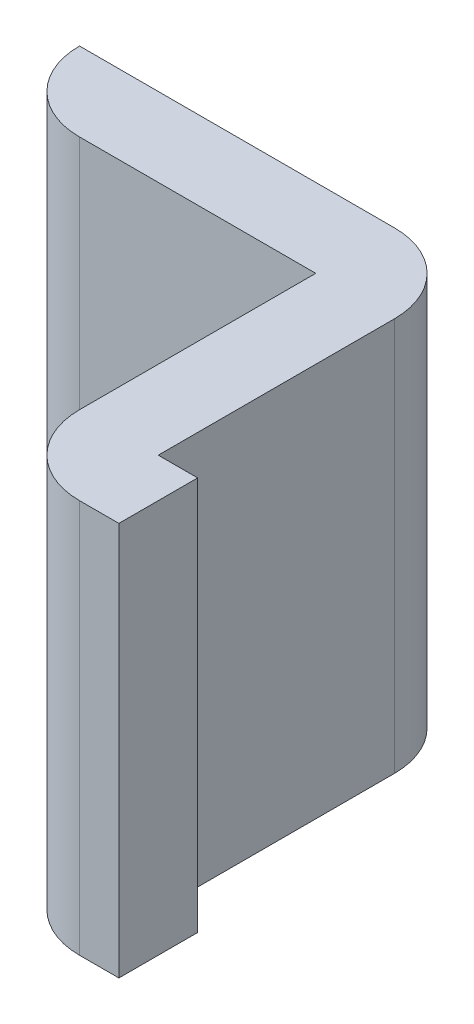
ISO-10303-21;
HEADER;
FILE_DESCRIPTION(('STEP AP214'),'2;1');
FILE_NAME('part.step','',(''),(''),'','','');
FILE_SCHEMA(('AUTOMOTIVE_DESIGN { 1 0 10303 214 1 1 1 1 }'));
ENDSEC;
DATA;
#1=APPLICATION_CONTEXT('core data for automotive mechanical design processes');
#2=APPLICATION_PROTOCOL_DEFINITION('international standard','automotive_design',2000,#1);
#3=PRODUCT_CONTEXT('',#1,'mechanical');
#4=PRODUCT('Part','Part','',(#3));
#5=PRODUCT_RELATED_PRODUCT_CATEGORY('part','',(#4));
#6=PRODUCT_DEFINITION_FORMATION('','',#4);
#7=PRODUCT_DEFINITION_CONTEXT('part definition',#1,'design');
#8=PRODUCT_DEFINITION('design','',#6,#7);
#9=PRODUCT_DEFINITION_SHAPE('','',#8);
#10=(LENGTH_UNIT() NAMED_UNIT(*) SI_UNIT(.MILLI.,.METRE.));
#11=(NAMED_UNIT(*) PLANE_ANGLE_UNIT() SI_UNIT($,.RADIAN.));
#12=(NAMED_UNIT(*) SI_UNIT($,.STERADIAN.) SOLID_ANGLE_UNIT());
#13=UNCERTAINTY_MEASURE_WITH_UNIT(LENGTH_MEASURE(1.E-05),#10,'distance_accuracy_value','');
#14=(GEOMETRIC_REPRESENTATION_CONTEXT(3) GLOBAL_UNCERTAINTY_ASSIGNED_CONTEXT((#13)) GLOBAL_UNIT_ASSIGNED_CONTEXT((#10,
#11,#12)) REPRESENTATION_CONTEXT('',''));
#15=CARTESIAN_POINT('',(0.,0.,0.));
#16=DIRECTION('',(0.,0.,1.));
#17=DIRECTION('',(1.,0.,0.));
#18=AXIS2_PLACEMENT_3D('',#15,#16,#17);
#19=CARTESIAN_POINT('',(0.3429,-0.1905,0.3048));
#20=DIRECTION('',(-1.,0.,0.));
#21=DIRECTION('',(0.,0.,1.));
#22=AXIS2_PLACEMENT_3D('',#19,#20,#21);
#23=PLANE('',#22);
#24=DIRECTION('',(0.,-1.,0.));
#25=VECTOR('',#24,1.);
#26=CARTESIAN_POINT('',(0.3429,-0.1905,0.0762));
#27=LINE('',#26,#25);
#28=CARTESIAN_POINT('',(0.3429,0.1905,0.0762));
#29=VERTEX_POINT('',#28);
#30=CARTESIAN_POINT('',(0.3429,-0.1905,0.0762));
#31=VERTEX_POINT('',#30);
#32=EDGE_CURVE('E83',#29,#31,#27,.T.);
#33=ORIENTED_EDGE('',*,*,#32,.F.);
#34=DIRECTION('',(0.,0.,-1.));
#35=VECTOR('',#34,1.);
#36=CARTESIAN_POINT('',(0.3429,0.1905,0.));
#37=LINE('',#36,#35);
#38=CARTESIAN_POINT('',(0.3429,0.1905,0.3048));
#39=VERTEX_POINT('',#38);
#40=EDGE_CURVE('E80',#29,#39,#37,.F.);
#41=ORIENTED_EDGE('',*,*,#40,.T.);
#42=DIRECTION('',(0.,1.,0.));
#43=VECTOR('',#42,1.);
#44=CARTESIAN_POINT('',(0.3429,-0.1905,0.3048));
#45=LINE('',#44,#43);
#46=CARTESIAN_POINT('',(0.3429,-0.1905,0.3048));
#47=VERTEX_POINT('',#46);
#48=EDGE_CURVE('E148',#39,#47,#45,.F.);
#49=ORIENTED_EDGE('',*,*,#48,.T.);
#50=DIRECTION('',(0.,0.,-1.));
#51=VECTOR('',#50,1.);
#52=CARTESIAN_POINT('',(0.3429,-0.1905,0.));
#53=LINE('',#52,#51);
#54=EDGE_CURVE('E153',#31,#47,#53,.F.);
#55=ORIENTED_EDGE('',*,*,#54,.F.);
#56=EDGE_LOOP('',(#33,#41,#49,#55));
#57=FACE_BOUND('',#56,.T.);
#58=ADVANCED_FACE('F17',(#57),#23,.F.);
#59=CARTESIAN_POINT('',(0.381,-0.1905,0.3048));
#60=DIRECTION('',(0.,0.,1.));
#61=DIRECTION('',(1.,0.,0.));
#62=AXIS2_PLACEMENT_3D('',#59,#60,#61);
#63=PLANE('',#62);
#64=ORIENTED_EDGE('',*,*,#48,.F.);
#65=DIRECTION('',(1.,0.,0.));
#66=VECTOR('',#65,1.);
#67=CARTESIAN_POINT('',(-0.0381,0.1905,0.3048));
#68=LINE('',#67,#66);
#69=CARTESIAN_POINT('',(0.381,0.1905,0.3048));
#70=VERTEX_POINT('',#69);
#71=EDGE_CURVE('E118',#39,#70,#68,.T.);
#72=ORIENTED_EDGE('',*,*,#71,.T.);
#73=DIRECTION('',(0.,1.,0.));
#74=VECTOR('',#73,1.);
#75=CARTESIAN_POINT('',(0.381,-0.1905,0.3048));
#76=LINE('',#75,#74);
#77=CARTESIAN_POINT('',(0.381,-0.1905,0.3048));
#78=VERTEX_POINT('',#77);
#79=EDGE_CURVE('E136',#70,#78,#76,.F.);
#80=ORIENTED_EDGE('',*,*,#79,.T.);
#81=DIRECTION('',(1.,0.,0.));
#82=VECTOR('',#81,1.);
#83=CARTESIAN_POINT('',(-0.0381,-0.1905,0.3048));
#84=LINE('',#83,#82);
#85=EDGE_CURVE('E143',#47,#78,#84,.T.);
#86=ORIENTED_EDGE('',*,*,#85,.F.);
#87=EDGE_LOOP('',(#64,#72,#80,#86));
#88=FACE_BOUND('',#87,.T.);
#89=ADVANCED_FACE('F315',(#88),#63,.F.);
#90=CARTESIAN_POINT('',(0.381,-0.1905,0.381));
#91=DIRECTION('',(-1.,0.,0.));
#92=DIRECTION('',(0.,0.,1.));
#93=AXIS2_PLACEMENT_3D('',#90,#91,#92);
#94=PLANE('',#93);
#95=ORIENTED_EDGE('',*,*,#79,.F.);
#96=DIRECTION('',(0.,0.,-1.));
#97=VECTOR('',#96,1.);
#98=CARTESIAN_POINT('',(0.381,0.1905,0.));
#99=LINE('',#98,#97);
#100=CARTESIAN_POINT('',(0.381,0.1905,0.381));
#101=VERTEX_POINT('',#100);
#102=EDGE_CURVE('E114',#70,#101,#99,.F.);
#103=ORIENTED_EDGE('',*,*,#102,.T.);
#104=DIRECTION('',(0.,1.,0.));
#105=VECTOR('',#104,1.);
#106=CARTESIAN_POINT('',(0.381,-0.1905,0.381));
#107=LINE('',#106,#105);
#108=CARTESIAN_POINT('',(0.381,-0.1905,0.381));
#109=VERTEX_POINT('',#108);
#110=EDGE_CURVE('E133',#101,#109,#107,.F.);
#111=ORIENTED_EDGE('',*,*,#110,.T.);
#112=DIRECTION('',(0.,0.,-1.));
#113=VECTOR('',#112,1.);
#114=CARTESIAN_POINT('',(0.381,-0.1905,0.));
#115=LINE('',#114,#113);
#116=EDGE_CURVE('E139',#78,#109,#115,.F.);
#117=ORIENTED_EDGE('',*,*,#116,.F.);
#118=EDGE_LOOP('',(#95,#103,#111,#117));
#119=FACE_BOUND('',#118,.T.);
#120=ADVANCED_FACE('F192',(#119),#94,.F.);
#121=CARTESIAN_POINT('',(0.3429,-0.1905,0.381));
#122=DIRECTION('',(0.,0.,-1.));
#123=DIRECTION('',(-1.,0.,0.));
#124=AXIS2_PLACEMENT_3D('',#121,#122,#123);
#125=PLANE('',#124);
#126=ORIENTED_EDGE('',*,*,#110,.F.);
#127=DIRECTION('',(1.,0.,0.));
#128=VECTOR('',#127,1.);
#129=CARTESIAN_POINT('',(-0.0381,0.1905,0.381));
#130=LINE('',#129,#128);
#131=CARTESIAN_POINT('',(0.3429,0.1905,0.381));
#132=VERTEX_POINT('',#131);
#133=EDGE_CURVE('E111',#101,#132,#130,.F.);
#134=ORIENTED_EDGE('',*,*,#133,.T.);
#135=DIRECTION('',(0.,-1.,0.));
#136=VECTOR('',#135,1.);
#137=CARTESIAN_POINT('',(0.3429,-0.1905,0.381));
#138=LINE('',#137,#136);
#139=CARTESIAN_POINT('',(0.3429,-0.1905,0.381));
#140=VERTEX_POINT('',#139);
#141=EDGE_CURVE('E131',#140,#132,#138,.F.);
#142=ORIENTED_EDGE('',*,*,#141,.F.);
#143=DIRECTION('',(1.,0.,0.));
#144=VECTOR('',#143,1.);
#145=CARTESIAN_POINT('',(-0.0381,-0.1905,0.381));
#146=LINE('',#145,#144);
#147=EDGE_CURVE('E142',#109,#140,#146,.F.);
#148=ORIENTED_EDGE('',*,*,#147,.F.);
#149=EDGE_LOOP('',(#126,#134,#142,#148));
#150=FACE_BOUND('',#149,.T.);
#151=ADVANCED_FACE('F185',(#150),#125,.F.);
#152=CARTESIAN_POINT('',(0.3429,-0.1905,0.3048));
#153=DIRECTION('',(0.,-1.,0.));
#154=DIRECTION('',(0.,0.,-1.));
#155=AXIS2_PLACEMENT_3D('',#152,#153,#154);
#156=CYLINDRICAL_SURFACE('',#155,0.0762);
#157=CARTESIAN_POINT('',(0.3429,0.1905,0.3048));
#158=DIRECTION('',(0.,-1.,0.));
#159=DIRECTION('',(0.,0.,-1.));
#160=AXIS2_PLACEMENT_3D('',#157,#158,#159);
#161=CIRCLE('',#160,0.0762);
#162=CARTESIAN_POINT('',(0.2667,0.1905,0.3048));
#163=VERTEX_POINT('',#162);
#164=EDGE_CURVE('E108',#132,#163,#161,.T.);
#165=ORIENTED_EDGE('',*,*,#164,.T.);
#166=DIRECTION('',(0.,1.,0.));
#167=VECTOR('',#166,1.);
#168=CARTESIAN_POINT('',(0.2667,-0.1905,0.3048));
#169=LINE('',#168,#167);
#170=CARTESIAN_POINT('',(0.2667,-0.1905,0.3048));
#171=VERTEX_POINT('',#170);
#172=EDGE_CURVE('E126',#163,#171,#169,.F.);
#173=ORIENTED_EDGE('',*,*,#172,.T.);
#174=CARTESIAN_POINT('',(0.3429,-0.1905,0.3048));
#175=DIRECTION('',(0.,-1.,0.));
#176=DIRECTION('',(0.,0.,-1.));
#177=AXIS2_PLACEMENT_3D('',#174,#175,#176);
#178=CIRCLE('',#177,0.0762);
#179=EDGE_CURVE('E169',#140,#171,#178,.T.);
#180=ORIENTED_EDGE('',*,*,#179,.F.);
#181=ORIENTED_EDGE('',*,*,#141,.T.);
#182=EDGE_LOOP('',(#165,#173,#180,#181));
#183=FACE_BOUND('',#182,.T.);
#184=ADVANCED_FACE('F176',(#183),#156,.T.);
#185=CARTESIAN_POINT('',(0.2667,-0.1905,0.0762));
#186=DIRECTION('',(1.,0.,0.));
#187=DIRECTION('',(0.,0.,-1.));
#188=AXIS2_PLACEMENT_3D('',#185,#186,#187);
#189=PLANE('',#188);
#190=ORIENTED_EDGE('',*,*,#172,.F.);
#191=DIRECTION('',(0.,0.,-1.));
#192=VECTOR('',#191,1.);
#193=CARTESIAN_POINT('',(0.2667,0.1905,0.));
#194=LINE('',#193,#192);
#195=CARTESIAN_POINT('',(0.2667,0.1905,0.0762));
#196=VERTEX_POINT('',#195);
#197=EDGE_CURVE('E103',#163,#196,#194,.T.);
#198=ORIENTED_EDGE('',*,*,#197,.T.);
#199=DIRECTION('',(0.,1.,0.));
#200=VECTOR('',#199,1.);
#201=CARTESIAN_POINT('',(0.2667,-0.1905,0.0762));
#202=LINE('',#201,#200);
#203=CARTESIAN_POINT('',(0.2667,-0.1905,0.0762));
#204=VERTEX_POINT('',#203);
#205=EDGE_CURVE('E123',#196,#204,#202,.F.);
#206=ORIENTED_EDGE('',*,*,#205,.T.);
#207=DIRECTION('',(0.,0.,-1.));
#208=VECTOR('',#207,1.);
#209=CARTESIAN_POINT('',(0.2667,-0.1905,0.));
#210=LINE('',#209,#208);
#211=EDGE_CURVE('E171',#171,#204,#210,.T.);
#212=ORIENTED_EDGE('',*,*,#211,.F.);
#213=EDGE_LOOP('',(#190,#198,#206,#212));
#214=FACE_BOUND('',#213,.T.);
#215=ADVANCED_FACE('F230',(#214),#189,.F.);
#216=CARTESIAN_POINT('',(0.0381,-0.1905,0.0762));
#217=DIRECTION('',(0.,0.,-1.));
#218=DIRECTION('',(-1.,0.,0.));
#219=AXIS2_PLACEMENT_3D('',#216,#217,#218);
#220=PLANE('',#219);
#221=ORIENTED_EDGE('',*,*,#205,.F.);
#222=DIRECTION('',(1.,0.,0.));
#223=VECTOR('',#222,1.);
#224=CARTESIAN_POINT('',(-0.0381,0.1905,0.0762));
#225=LINE('',#224,#223);
#226=CARTESIAN_POINT('',(0.0381,0.1905,0.0762));
#227=VERTEX_POINT('',#226);
#228=EDGE_CURVE('E99',#196,#227,#225,.F.);
#229=ORIENTED_EDGE('',*,*,#228,.T.);
#230=DIRECTION('',(0.,-1.,0.));
#231=VECTOR('',#230,1.);
#232=CARTESIAN_POINT('',(0.0381,-0.1905,0.0762));
#233=LINE('',#232,#231);
#234=CARTESIAN_POINT('',(0.0381,-0.1905,0.0762));
#235=VERTEX_POINT('',#234);
#236=EDGE_CURVE('E102',#235,#227,#233,.F.);
#237=ORIENTED_EDGE('',*,*,#236,.F.);
#238=DIRECTION('',(1.,0.,0.));
#239=VECTOR('',#238,1.);
#240=CARTESIAN_POINT('',(-0.0381,-0.1905,0.0762));
#241=LINE('',#240,#239);
#242=EDGE_CURVE('E95',#204,#235,#241,.F.);
#243=ORIENTED_EDGE('',*,*,#242,.F.);
#244=EDGE_LOOP('',(#221,#229,#237,#243));
#245=FACE_BOUND('',#244,.T.);
#246=ADVANCED_FACE('F228',(#245),#220,.F.);
#247=CARTESIAN_POINT('',(0.2667,-0.1905,0.0762));
#248=DIRECTION('',(0.,-1.,0.));
#249=DIRECTION('',(0.,0.,-1.));
#250=AXIS2_PLACEMENT_3D('',#247,#248,#249);
#251=CYLINDRICAL_SURFACE('',#250,0.0762);
#252=CARTESIAN_POINT('',(0.2667,0.1905,0.0762));
#253=DIRECTION('',(0.,-1.,0.));
#254=DIRECTION('',(0.,0.,-1.));
#255=AXIS2_PLACEMENT_3D('',#252,#253,#254);
#256=CIRCLE('',#255,0.0762);
#257=CARTESIAN_POINT('',(0.2667,0.1905,0.));
#258=VERTEX_POINT('',#257);
#259=EDGE_CURVE('E20',#258,#29,#256,.T.);
#260=ORIENTED_EDGE('',*,*,#259,.T.);
#261=ORIENTED_EDGE('',*,*,#32,.T.);
#262=CARTESIAN_POINT('',(0.2667,-0.1905,0.0762));
#263=DIRECTION('',(0.,-1.,0.));
#264=DIRECTION('',(0.,0.,-1.));
#265=AXIS2_PLACEMENT_3D('',#262,#263,#264);
#266=CIRCLE('',#265,0.0762);
#267=CARTESIAN_POINT('',(0.2667,-0.1905,0.));
#268=VERTEX_POINT('',#267);
#269=EDGE_CURVE('E93',#268,#31,#266,.T.);
#270=ORIENTED_EDGE('',*,*,#269,.F.);
#271=DIRECTION('',(0.,1.,0.));
#272=VECTOR('',#271,1.);
#273=CARTESIAN_POINT('',(0.2667,-0.1905,0.));
#274=LINE('',#273,#272);
#275=EDGE_CURVE('E87',#268,#258,#274,.T.);
#276=ORIENTED_EDGE('',*,*,#275,.T.);
#277=EDGE_LOOP('',(#260,#261,#270,#276));
#278=FACE_BOUND('',#277,.T.);
#279=ADVANCED_FACE('F91',(#278),#251,.T.);
#280=CARTESIAN_POINT('',(-0.0381,0.1905,0.));
#281=DIRECTION('',(0.,-1.,0.));
#282=DIRECTION('',(0.,0.,-1.));
#283=AXIS2_PLACEMENT_3D('',#280,#281,#282);
#284=PLANE('',#283);
#285=ORIENTED_EDGE('',*,*,#228,.F.);
#286=ORIENTED_EDGE('',*,*,#197,.F.);
#287=ORIENTED_EDGE('',*,*,#164,.F.);
#288=ORIENTED_EDGE('',*,*,#133,.F.);
#289=ORIENTED_EDGE('',*,*,#102,.F.);
#290=ORIENTED_EDGE('',*,*,#71,.F.);
#291=ORIENTED_EDGE('',*,*,#40,.F.);
#292=ORIENTED_EDGE('',*,*,#259,.F.);
#293=DIRECTION('',(1.,0.,0.));
#294=VECTOR('',#293,1.);
#295=CARTESIAN_POINT('',(0.2667,0.1905,0.));
#296=LINE('',#295,#294);
#297=CARTESIAN_POINT('',(-0.0381,0.1905,0.));
#298=VERTEX_POINT('',#297);
#299=EDGE_CURVE('E77',#258,#298,#296,.F.);
#300=ORIENTED_EDGE('',*,*,#299,.T.);
#301=CARTESIAN_POINT('',(0.0381,0.1905,0.));
#302=DIRECTION('',(0.,-1.,0.));
#303=DIRECTION('',(0.,0.,-1.));
#304=AXIS2_PLACEMENT_3D('',#301,#302,#303);
#305=CIRCLE('',#304,0.0762);
#306=EDGE_CURVE('E122',#227,#298,#305,.T.);
#307=ORIENTED_EDGE('',*,*,#306,.F.);
#308=EDGE_LOOP('',(#285,#286,#287,#288,#289,#290,#291,#292,#300,#307));
#309=FACE_BOUND('',#308,.T.);
#310=ADVANCED_FACE('F75',(#309),#284,.F.);
#311=CARTESIAN_POINT('',(0.0381,-0.1905,0.));
#312=DIRECTION('',(0.,-1.,0.));
#313=DIRECTION('',(0.,0.,-1.));
#314=AXIS2_PLACEMENT_3D('',#311,#312,#313);
#315=CYLINDRICAL_SURFACE('',#314,0.0762);
#316=ORIENTED_EDGE('',*,*,#306,.T.);
#317=DIRECTION('',(0.,1.,0.));
#318=VECTOR('',#317,1.);
#319=CARTESIAN_POINT('',(-0.0381,-0.1905,0.));
#320=LINE('',#319,#318);
#321=CARTESIAN_POINT('',(-0.0381,-0.1905,0.));
#322=VERTEX_POINT('',#321);
#323=EDGE_CURVE('E26',#298,#322,#320,.F.);
#324=ORIENTED_EDGE('',*,*,#323,.T.);
#325=CARTESIAN_POINT('',(0.0381,-0.1905,0.));
#326=DIRECTION('',(0.,-1.,0.));
#327=DIRECTION('',(0.,0.,-1.));
#328=AXIS2_PLACEMENT_3D('',#325,#326,#327);
#329=CIRCLE('',#328,0.0762);
#330=EDGE_CURVE('E34',#235,#322,#329,.T.);
#331=ORIENTED_EDGE('',*,*,#330,.F.);
#332=ORIENTED_EDGE('',*,*,#236,.T.);
#333=EDGE_LOOP('',(#316,#324,#331,#332));
#334=FACE_BOUND('',#333,.T.);
#335=ADVANCED_FACE('F210',(#334),#315,.T.);
#336=CARTESIAN_POINT('',(-0.0381,-0.1905,0.));
#337=DIRECTION('',(0.,-1.,0.));
#338=DIRECTION('',(0.,0.,-1.));
#339=AXIS2_PLACEMENT_3D('',#336,#337,#338);
#340=PLANE('',#339);
#341=ORIENTED_EDGE('',*,*,#242,.T.);
#342=ORIENTED_EDGE('',*,*,#330,.T.);
#343=DIRECTION('',(1.,0.,0.));
#344=VECTOR('',#343,1.);
#345=CARTESIAN_POINT('',(0.2667,-0.1905,0.));
#346=LINE('',#345,#344);
#347=EDGE_CURVE('E11',#322,#268,#346,.T.);
#348=ORIENTED_EDGE('',*,*,#347,.T.);
#349=ORIENTED_EDGE('',*,*,#269,.T.);
#350=ORIENTED_EDGE('',*,*,#54,.T.);
#351=ORIENTED_EDGE('',*,*,#85,.T.);
#352=ORIENTED_EDGE('',*,*,#116,.T.);
#353=ORIENTED_EDGE('',*,*,#147,.T.);
#354=ORIENTED_EDGE('',*,*,#179,.T.);
#355=ORIENTED_EDGE('',*,*,#211,.T.);
#356=EDGE_LOOP('',(#341,#342,#348,#349,#350,#351,#352,#353,#354,#355));
#357=FACE_BOUND('',#356,.T.);
#358=ADVANCED_FACE('F208',(#357),#340,.T.);
#359=CARTESIAN_POINT('',(0.2667,-0.1905,0.));
#360=DIRECTION('',(0.,0.,1.));
#361=DIRECTION('',(1.,0.,0.));
#362=AXIS2_PLACEMENT_3D('',#359,#360,#361);
#363=PLANE('',#362);
#364=ORIENTED_EDGE('',*,*,#323,.F.);
#365=ORIENTED_EDGE('',*,*,#299,.F.);
#366=ORIENTED_EDGE('',*,*,#275,.F.);
#367=ORIENTED_EDGE('',*,*,#347,.F.);
#368=EDGE_LOOP('',(#364,#365,#366,#367));
#369=FACE_BOUND('',#368,.T.);
#370=ADVANCED_FACE('F86',(#369),#363,.F.);
#371=CLOSED_SHELL('',(#58,#89,#120,#151,#184,#215,#246,#279,#310,#335,#358,#370));
#372=MANIFOLD_SOLID_BREP('B1',#371);
#373=ADVANCED_BREP_SHAPE_REPRESENTATION('',(#18,#372),#14);
#374=SHAPE_DEFINITION_REPRESENTATION(#9,#373);
ENDSEC;
END-ISO-10303-21;
